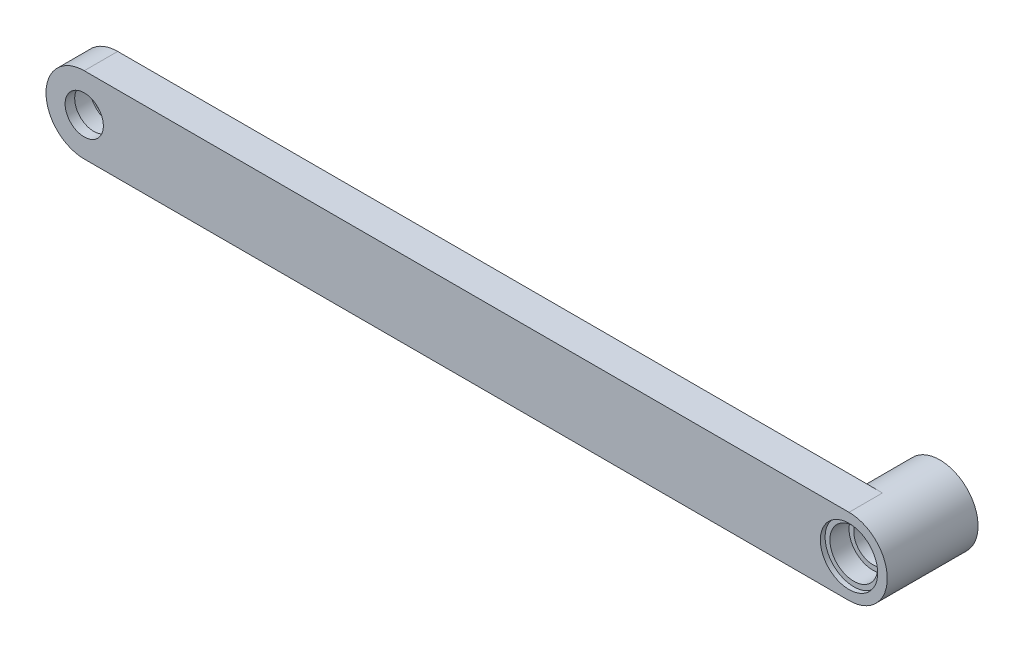
ISO-10303-21;
HEADER;
FILE_DESCRIPTION(('STEP AP214'),'2;1');
FILE_NAME('part.step','',(''),(''),'','','');
FILE_SCHEMA(('AUTOMOTIVE_DESIGN { 1 0 10303 214 1 1 1 1 }'));
ENDSEC;
DATA;
#1=APPLICATION_CONTEXT('core data for automotive mechanical design processes');
#2=APPLICATION_PROTOCOL_DEFINITION('international standard','automotive_design',2000,#1);
#3=PRODUCT_CONTEXT('',#1,'mechanical');
#4=PRODUCT('Part','Part','',(#3));
#5=PRODUCT_RELATED_PRODUCT_CATEGORY('part','',(#4));
#6=PRODUCT_DEFINITION_FORMATION('','',#4);
#7=PRODUCT_DEFINITION_CONTEXT('part definition',#1,'design');
#8=PRODUCT_DEFINITION('design','',#6,#7);
#9=PRODUCT_DEFINITION_SHAPE('','',#8);
#10=(LENGTH_UNIT() NAMED_UNIT(*) SI_UNIT(.MILLI.,.METRE.));
#11=(NAMED_UNIT(*) PLANE_ANGLE_UNIT() SI_UNIT($,.RADIAN.));
#12=(NAMED_UNIT(*) SI_UNIT($,.STERADIAN.) SOLID_ANGLE_UNIT());
#13=UNCERTAINTY_MEASURE_WITH_UNIT(LENGTH_MEASURE(1.E-05),#10,'distance_accuracy_value','');
#14=(GEOMETRIC_REPRESENTATION_CONTEXT(3) GLOBAL_UNCERTAINTY_ASSIGNED_CONTEXT((#13)) GLOBAL_UNIT_ASSIGNED_CONTEXT((#10,
#11,#12)) REPRESENTATION_CONTEXT('',''));
#15=CARTESIAN_POINT('',(0.,0.,0.));
#16=DIRECTION('',(0.,0.,1.));
#17=DIRECTION('',(1.,0.,0.));
#18=AXIS2_PLACEMENT_3D('',#15,#16,#17);
#19=CARTESIAN_POINT('',(80.,0.,1.));
#20=DIRECTION('',(0.,0.,1.));
#21=DIRECTION('',(1.,0.,0.));
#22=AXIS2_PLACEMENT_3D('',#19,#20,#21);
#23=CYLINDRICAL_SURFACE('',#22,2.50000000000001);
#24=CARTESIAN_POINT('',(80.,0.,1.));
#25=DIRECTION('',(0.,0.,1.));
#26=DIRECTION('',(1.,0.,0.));
#27=AXIS2_PLACEMENT_3D('',#24,#25,#26);
#28=CIRCLE('',#27,2.50000000000001);
#29=CARTESIAN_POINT('',(82.5,0.,1.));
#30=VERTEX_POINT('',#29);
#31=EDGE_CURVE('E174',#30,#30,#28,.T.);
#32=ORIENTED_EDGE('',*,*,#31,.F.);
#33=EDGE_LOOP('',(#32));
#34=FACE_BOUND('',#33,.T.);
#35=CARTESIAN_POINT('',(80.,0.,3.));
#36=DIRECTION('',(0.,0.,1.));
#37=DIRECTION('',(1.,0.,0.));
#38=AXIS2_PLACEMENT_3D('',#35,#36,#37);
#39=CIRCLE('',#38,2.50000000000001);
#40=CARTESIAN_POINT('',(82.5,0.,3.));
#41=VERTEX_POINT('',#40);
#42=EDGE_CURVE('E183',#41,#41,#39,.T.);
#43=ORIENTED_EDGE('',*,*,#42,.T.);
#44=EDGE_LOOP('',(#43));
#45=FACE_BOUND('',#44,.T.);
#46=ADVANCED_FACE('F38',(#34,#45),#23,.F.);
#47=CARTESIAN_POINT('',(80.,0.,3.5));
#48=DIRECTION('',(0.,0.,-1.));
#49=DIRECTION('',(-1.,0.,0.));
#50=AXIS2_PLACEMENT_3D('',#47,#48,#49);
#51=CYLINDRICAL_SURFACE('',#50,2.);
#52=CARTESIAN_POINT('',(80.,0.,-3.5));
#53=DIRECTION('',(0.,0.,-1.));
#54=DIRECTION('',(-1.,0.,0.));
#55=AXIS2_PLACEMENT_3D('',#52,#53,#54);
#56=CIRCLE('',#55,2.);
#57=CARTESIAN_POINT('',(78.,0.,-3.5));
#58=VERTEX_POINT('',#57);
#59=EDGE_CURVE('E158',#58,#58,#56,.T.);
#60=ORIENTED_EDGE('',*,*,#59,.T.);
#61=EDGE_LOOP('',(#60));
#62=FACE_BOUND('',#61,.T.);
#63=CARTESIAN_POINT('',(80.,0.,1.));
#64=DIRECTION('',(0.,0.,1.));
#65=DIRECTION('',(1.,0.,0.));
#66=AXIS2_PLACEMENT_3D('',#63,#64,#65);
#67=CIRCLE('',#66,2.);
#68=CARTESIAN_POINT('',(82.,0.,1.));
#69=VERTEX_POINT('',#68);
#70=EDGE_CURVE('E42',#69,#69,#67,.F.);
#71=ORIENTED_EDGE('',*,*,#70,.F.);
#72=EDGE_LOOP('',(#71));
#73=FACE_BOUND('',#72,.T.);
#74=ADVANCED_FACE('F222',(#62,#73),#51,.F.);
#75=CARTESIAN_POINT('',(80.,0.,-3.5));
#76=DIRECTION('',(0.,0.,-1.));
#77=DIRECTION('',(-1.,0.,0.));
#78=AXIS2_PLACEMENT_3D('',#75,#76,#77);
#79=CYLINDRICAL_SURFACE('',#78,2.50000000000001);
#80=CARTESIAN_POINT('',(80.,0.,-3.5));
#81=DIRECTION('',(0.,0.,-1.));
#82=DIRECTION('',(-1.,0.,0.));
#83=AXIS2_PLACEMENT_3D('',#80,#81,#82);
#84=CIRCLE('',#83,2.50000000000001);
#85=CARTESIAN_POINT('',(77.5,0.,-3.5));
#86=VERTEX_POINT('',#85);
#87=EDGE_CURVE('E154',#86,#86,#84,.T.);
#88=ORIENTED_EDGE('',*,*,#87,.F.);
#89=EDGE_LOOP('',(#88));
#90=FACE_BOUND('',#89,.T.);
#91=CARTESIAN_POINT('',(80.,0.,-5.5));
#92=DIRECTION('',(0.,0.,-1.));
#93=DIRECTION('',(-1.,0.,0.));
#94=AXIS2_PLACEMENT_3D('',#91,#92,#93);
#95=CIRCLE('',#94,2.50000000000001);
#96=CARTESIAN_POINT('',(77.5,0.,-5.5));
#97=VERTEX_POINT('',#96);
#98=EDGE_CURVE('E167',#97,#97,#95,.T.);
#99=ORIENTED_EDGE('',*,*,#98,.T.);
#100=EDGE_LOOP('',(#99));
#101=FACE_BOUND('',#100,.T.);
#102=ADVANCED_FACE('F230',(#90,#101),#79,.F.);
#103=CARTESIAN_POINT('',(0.,0.,2.5));
#104=DIRECTION('',(0.,0.,-1.));
#105=DIRECTION('',(-1.,0.,0.));
#106=AXIS2_PLACEMENT_3D('',#103,#104,#105);
#107=CYLINDRICAL_SURFACE('',#106,2.5);
#108=CARTESIAN_POINT('',(0.,0.,2.5));
#109=DIRECTION('',(0.,0.,-1.));
#110=DIRECTION('',(-1.,0.,0.));
#111=AXIS2_PLACEMENT_3D('',#108,#109,#110);
#112=CIRCLE('',#111,2.5);
#113=CARTESIAN_POINT('',(-2.5,0.,2.5));
#114=VERTEX_POINT('',#113);
#115=EDGE_CURVE('E130',#114,#114,#112,.T.);
#116=ORIENTED_EDGE('',*,*,#115,.F.);
#117=EDGE_LOOP('',(#116));
#118=FACE_BOUND('',#117,.T.);
#119=CARTESIAN_POINT('',(0.,0.,0.5));
#120=DIRECTION('',(0.,0.,-1.));
#121=DIRECTION('',(-1.,0.,0.));
#122=AXIS2_PLACEMENT_3D('',#119,#120,#121);
#123=CIRCLE('',#122,2.5);
#124=CARTESIAN_POINT('',(-2.5,0.,0.5));
#125=VERTEX_POINT('',#124);
#126=EDGE_CURVE('E143',#125,#125,#123,.T.);
#127=ORIENTED_EDGE('',*,*,#126,.T.);
#128=EDGE_LOOP('',(#127));
#129=FACE_BOUND('',#128,.T.);
#130=ADVANCED_FACE('F250',(#118,#129),#107,.F.);
#131=CARTESIAN_POINT('',(0.,0.,3.5));
#132=DIRECTION('',(0.,0.,-1.));
#133=DIRECTION('',(-1.,0.,0.));
#134=AXIS2_PLACEMENT_3D('',#131,#132,#133);
#135=CYLINDRICAL_SURFACE('',#134,2.);
#136=CARTESIAN_POINT('',(0.,0.,3.5));
#137=DIRECTION('',(0.,0.,-1.));
#138=DIRECTION('',(-1.,0.,0.));
#139=AXIS2_PLACEMENT_3D('',#136,#137,#138);
#140=CIRCLE('',#139,2.);
#141=CARTESIAN_POINT('',(-2.,0.,3.5));
#142=VERTEX_POINT('',#141);
#143=EDGE_CURVE('E118',#142,#142,#140,.T.);
#144=ORIENTED_EDGE('',*,*,#143,.F.);
#145=EDGE_LOOP('',(#144));
#146=FACE_BOUND('',#145,.T.);
#147=CARTESIAN_POINT('',(0.,0.,2.5));
#148=DIRECTION('',(0.,0.,-1.));
#149=DIRECTION('',(-1.,0.,0.));
#150=AXIS2_PLACEMENT_3D('',#147,#148,#149);
#151=CIRCLE('',#150,2.);
#152=CARTESIAN_POINT('',(-2.,0.,2.5));
#153=VERTEX_POINT('',#152);
#154=EDGE_CURVE('E134',#153,#153,#151,.T.);
#155=ORIENTED_EDGE('',*,*,#154,.T.);
#156=EDGE_LOOP('',(#155));
#157=FACE_BOUND('',#156,.T.);
#158=ADVANCED_FACE('F220',(#146,#157),#135,.F.);
#159=CARTESIAN_POINT('',(0.,0.,3.5));
#160=DIRECTION('',(0.,0.,-1.));
#161=DIRECTION('',(-1.,0.,0.));
#162=AXIS2_PLACEMENT_3D('',#159,#160,#161);
#163=CYLINDRICAL_SURFACE('',#162,4.);
#164=CARTESIAN_POINT('',(0.,0.,0.));
#165=DIRECTION('',(0.,0.,1.));
#166=DIRECTION('',(1.,0.,0.));
#167=AXIS2_PLACEMENT_3D('',#164,#165,#166);
#168=CIRCLE('',#167,4.);
#169=CARTESIAN_POINT('',(0.,4.,0.));
#170=VERTEX_POINT('',#169);
#171=CARTESIAN_POINT('',(0.,-4.,0.));
#172=VERTEX_POINT('',#171);
#173=EDGE_CURVE('E90',#170,#172,#168,.T.);
#174=ORIENTED_EDGE('',*,*,#173,.T.);
#175=DIRECTION('',(0.,0.,-1.));
#176=VECTOR('',#175,1.);
#177=CARTESIAN_POINT('',(0.,-4.,3.5));
#178=LINE('',#177,#176);
#179=CARTESIAN_POINT('',(0.,-4.,3.5));
#180=VERTEX_POINT('',#179);
#181=EDGE_CURVE('E49',#180,#172,#178,.T.);
#182=ORIENTED_EDGE('',*,*,#181,.F.);
#183=CARTESIAN_POINT('',(0.,0.,3.5));
#184=DIRECTION('',(0.,0.,1.));
#185=DIRECTION('',(1.,0.,0.));
#186=AXIS2_PLACEMENT_3D('',#183,#184,#185);
#187=CIRCLE('',#186,4.);
#188=CARTESIAN_POINT('',(0.,4.,3.5));
#189=VERTEX_POINT('',#188);
#190=EDGE_CURVE('E92',#189,#180,#187,.T.);
#191=ORIENTED_EDGE('',*,*,#190,.F.);
#192=DIRECTION('',(0.,0.,-1.));
#193=VECTOR('',#192,1.);
#194=CARTESIAN_POINT('',(0.,4.,3.5));
#195=LINE('',#194,#193);
#196=EDGE_CURVE('E102',#189,#170,#195,.T.);
#197=ORIENTED_EDGE('',*,*,#196,.T.);
#198=EDGE_LOOP('',(#174,#182,#191,#197));
#199=FACE_BOUND('',#198,.T.);
#200=ADVANCED_FACE('F40',(#199),#163,.T.);
#201=CARTESIAN_POINT('',(0.,-4.,3.5));
#202=DIRECTION('',(0.,1.,0.));
#203=DIRECTION('',(-1.,0.,0.));
#204=AXIS2_PLACEMENT_3D('',#201,#202,#203);
#205=PLANE('',#204);
#206=DIRECTION('',(1.,0.,0.));
#207=VECTOR('',#206,1.);
#208=CARTESIAN_POINT('',(0.,-4.,0.));
#209=LINE('',#208,#207);
#210=CARTESIAN_POINT('',(80.,-4.00000000000001,0.));
#211=VERTEX_POINT('',#210);
#212=EDGE_CURVE('E93',#172,#211,#209,.T.);
#213=ORIENTED_EDGE('',*,*,#212,.T.);
#214=DIRECTION('',(0.,0.,-1.));
#215=VECTOR('',#214,1.);
#216=CARTESIAN_POINT('',(80.,-4.00000000000001,3.5));
#217=LINE('',#216,#215);
#218=CARTESIAN_POINT('',(80.,-4.00000000000001,3.5));
#219=VERTEX_POINT('',#218);
#220=EDGE_CURVE('E101',#219,#211,#217,.T.);
#221=ORIENTED_EDGE('',*,*,#220,.F.);
#222=DIRECTION('',(1.,0.,0.));
#223=VECTOR('',#222,1.);
#224=CARTESIAN_POINT('',(0.,-4.,3.5));
#225=LINE('',#224,#223);
#226=EDGE_CURVE('E84',#180,#219,#225,.T.);
#227=ORIENTED_EDGE('',*,*,#226,.F.);
#228=ORIENTED_EDGE('',*,*,#181,.T.);
#229=EDGE_LOOP('',(#213,#221,#227,#228));
#230=FACE_BOUND('',#229,.T.);
#231=ADVANCED_FACE('F213',(#230),#205,.F.);
#232=CARTESIAN_POINT('',(80.,0.,3.5));
#233=DIRECTION('',(0.,0.,-1.));
#234=DIRECTION('',(-1.,0.,0.));
#235=AXIS2_PLACEMENT_3D('',#232,#233,#234);
#236=CYLINDRICAL_SURFACE('',#235,4.00000000000001);
#237=ORIENTED_EDGE('',*,*,#220,.T.);
#238=CARTESIAN_POINT('',(80.,0.,0.));
#239=DIRECTION('',(0.,0.,-1.));
#240=DIRECTION('',(-1.,0.,0.));
#241=AXIS2_PLACEMENT_3D('',#238,#239,#240);
#242=CIRCLE('',#241,4.00000000000001);
#243=CARTESIAN_POINT('',(80.,4.00000000000001,0.));
#244=VERTEX_POINT('',#243);
#245=EDGE_CURVE('E11',#211,#244,#242,.T.);
#246=ORIENTED_EDGE('',*,*,#245,.T.);
#247=DIRECTION('',(0.,0.,-1.));
#248=VECTOR('',#247,1.);
#249=CARTESIAN_POINT('',(80.,4.00000000000001,3.5));
#250=LINE('',#249,#248);
#251=CARTESIAN_POINT('',(80.,4.00000000000001,3.5));
#252=VERTEX_POINT('',#251);
#253=EDGE_CURVE('E96',#252,#244,#250,.T.);
#254=ORIENTED_EDGE('',*,*,#253,.F.);
#255=CARTESIAN_POINT('',(80.,0.,3.5));
#256=DIRECTION('',(0.,0.,1.));
#257=DIRECTION('',(1.,0.,0.));
#258=AXIS2_PLACEMENT_3D('',#255,#256,#257);
#259=CIRCLE('',#258,4.00000000000001);
#260=EDGE_CURVE('E107',#219,#252,#259,.T.);
#261=ORIENTED_EDGE('',*,*,#260,.F.);
#262=EDGE_LOOP('',(#237,#246,#254,#261));
#263=FACE_BOUND('',#262,.T.);
#264=CARTESIAN_POINT('',(80.,0.,-6.));
#265=DIRECTION('',(0.,0.,-1.));
#266=DIRECTION('',(-1.,0.,0.));
#267=AXIS2_PLACEMENT_3D('',#264,#265,#266);
#268=CIRCLE('',#267,4.00000000000001);
#269=CARTESIAN_POINT('',(76.,0.,-6.));
#270=VERTEX_POINT('',#269);
#271=EDGE_CURVE('E144',#270,#270,#268,.T.);
#272=ORIENTED_EDGE('',*,*,#271,.F.);
#273=EDGE_LOOP('',(#272));
#274=FACE_BOUND('',#273,.T.);
#275=ADVANCED_FACE('F105',(#263,#274),#236,.T.);
#276=CARTESIAN_POINT('',(0.,4.,3.5));
#277=DIRECTION('',(0.,-1.,0.));
#278=DIRECTION('',(1.,0.,0.));
#279=AXIS2_PLACEMENT_3D('',#276,#277,#278);
#280=PLANE('',#279);
#281=DIRECTION('',(-1.,0.,0.));
#282=VECTOR('',#281,1.);
#283=CARTESIAN_POINT('',(0.,4.,0.));
#284=LINE('',#283,#282);
#285=EDGE_CURVE('E76',#244,#170,#284,.T.);
#286=ORIENTED_EDGE('',*,*,#285,.T.);
#287=ORIENTED_EDGE('',*,*,#196,.F.);
#288=DIRECTION('',(-1.,0.,0.));
#289=VECTOR('',#288,1.);
#290=CARTESIAN_POINT('',(0.,4.,3.5));
#291=LINE('',#290,#289);
#292=EDGE_CURVE('E58',#252,#189,#291,.T.);
#293=ORIENTED_EDGE('',*,*,#292,.F.);
#294=ORIENTED_EDGE('',*,*,#253,.T.);
#295=EDGE_LOOP('',(#286,#287,#293,#294));
#296=FACE_BOUND('',#295,.T.);
#297=ADVANCED_FACE('F97',(#296),#280,.F.);
#298=CARTESIAN_POINT('',(0.,0.,3.5));
#299=DIRECTION('',(0.,0.,1.));
#300=DIRECTION('',(1.,0.,0.));
#301=AXIS2_PLACEMENT_3D('',#298,#299,#300);
#302=PLANE('',#301);
#303=CARTESIAN_POINT('',(80.,0.,3.5));
#304=DIRECTION('',(0.,0.,1.));
#305=DIRECTION('',(1.,0.,0.));
#306=AXIS2_PLACEMENT_3D('',#303,#304,#305);
#307=CIRCLE('',#306,3.00000000000001);
#308=CARTESIAN_POINT('',(83.,0.,3.5));
#309=VERTEX_POINT('',#308);
#310=EDGE_CURVE('E179',#309,#309,#307,.T.);
#311=ORIENTED_EDGE('',*,*,#310,.F.);
#312=EDGE_LOOP('',(#311));
#313=FACE_BOUND('',#312,.T.);
#314=ORIENTED_EDGE('',*,*,#143,.T.);
#315=EDGE_LOOP('',(#314));
#316=FACE_BOUND('',#315,.T.);
#317=ORIENTED_EDGE('',*,*,#190,.T.);
#318=ORIENTED_EDGE('',*,*,#226,.T.);
#319=ORIENTED_EDGE('',*,*,#260,.T.);
#320=ORIENTED_EDGE('',*,*,#292,.T.);
#321=EDGE_LOOP('',(#317,#318,#319,#320));
#322=FACE_BOUND('',#321,.T.);
#323=ADVANCED_FACE('F205',(#313,#316,#322),#302,.T.);
#324=CARTESIAN_POINT('',(0.,0.,0.));
#325=DIRECTION('',(0.,0.,1.));
#326=DIRECTION('',(1.,0.,0.));
#327=AXIS2_PLACEMENT_3D('',#324,#325,#326);
#328=PLANE('',#327);
#329=ORIENTED_EDGE('',*,*,#245,.F.);
#330=ORIENTED_EDGE('',*,*,#212,.F.);
#331=ORIENTED_EDGE('',*,*,#173,.F.);
#332=ORIENTED_EDGE('',*,*,#285,.F.);
#333=EDGE_LOOP('',(#329,#330,#331,#332));
#334=FACE_BOUND('',#333,.T.);
#335=CARTESIAN_POINT('',(0.,0.,0.));
#336=DIRECTION('',(0.,0.,-1.));
#337=DIRECTION('',(-1.,0.,0.));
#338=AXIS2_PLACEMENT_3D('',#335,#336,#337);
#339=CIRCLE('',#338,3.);
#340=CARTESIAN_POINT('',(-3.,0.,0.));
#341=VERTEX_POINT('',#340);
#342=EDGE_CURVE('E139',#341,#341,#339,.T.);
#343=ORIENTED_EDGE('',*,*,#342,.F.);
#344=EDGE_LOOP('',(#343));
#345=FACE_BOUND('',#344,.T.);
#346=ADVANCED_FACE('F87',(#334,#345),#328,.F.);
#347=CARTESIAN_POINT('',(0.,0.,2.5));
#348=DIRECTION('',(0.,0.,-1.));
#349=DIRECTION('',(-1.,0.,0.));
#350=AXIS2_PLACEMENT_3D('',#347,#348,#349);
#351=PLANE('',#350);
#352=ORIENTED_EDGE('',*,*,#154,.F.);
#353=EDGE_LOOP('',(#352));
#354=FACE_BOUND('',#353,.T.);
#355=ORIENTED_EDGE('',*,*,#115,.T.);
#356=EDGE_LOOP('',(#355));
#357=FACE_BOUND('',#356,.T.);
#358=ADVANCED_FACE('F263',(#354,#357),#351,.T.);
#359=CARTESIAN_POINT('',(0.,0.,0.5));
#360=DIRECTION('',(0.,0.,-1.));
#361=DIRECTION('',(-1.,0.,0.));
#362=AXIS2_PLACEMENT_3D('',#359,#360,#361);
#363=CYLINDRICAL_SURFACE('',#362,3.);
#364=CARTESIAN_POINT('',(0.,0.,0.5));
#365=DIRECTION('',(0.,0.,-1.));
#366=DIRECTION('',(-1.,0.,0.));
#367=AXIS2_PLACEMENT_3D('',#364,#365,#366);
#368=CIRCLE('',#367,3.);
#369=CARTESIAN_POINT('',(-3.,0.,0.5));
#370=VERTEX_POINT('',#369);
#371=EDGE_CURVE('E138',#370,#370,#368,.T.);
#372=ORIENTED_EDGE('',*,*,#371,.F.);
#373=EDGE_LOOP('',(#372));
#374=FACE_BOUND('',#373,.T.);
#375=ORIENTED_EDGE('',*,*,#342,.T.);
#376=EDGE_LOOP('',(#375));
#377=FACE_BOUND('',#376,.T.);
#378=ADVANCED_FACE('F259',(#374,#377),#363,.F.);
#379=CARTESIAN_POINT('',(0.,0.,0.5));
#380=DIRECTION('',(0.,0.,-1.));
#381=DIRECTION('',(-1.,0.,0.));
#382=AXIS2_PLACEMENT_3D('',#379,#380,#381);
#383=PLANE('',#382);
#384=ORIENTED_EDGE('',*,*,#126,.F.);
#385=EDGE_LOOP('',(#384));
#386=FACE_BOUND('',#385,.T.);
#387=ORIENTED_EDGE('',*,*,#371,.T.);
#388=EDGE_LOOP('',(#387));
#389=FACE_BOUND('',#388,.T.);
#390=ADVANCED_FACE('F255',(#386,#389),#383,.T.);
#391=CARTESIAN_POINT('',(80.,0.,-6.));
#392=DIRECTION('',(0.,0.,-1.));
#393=DIRECTION('',(-1.,0.,0.));
#394=AXIS2_PLACEMENT_3D('',#391,#392,#393);
#395=PLANE('',#394);
#396=CARTESIAN_POINT('',(80.,0.,-6.));
#397=DIRECTION('',(0.,0.,-1.));
#398=DIRECTION('',(-1.,0.,0.));
#399=AXIS2_PLACEMENT_3D('',#396,#397,#398);
#400=CIRCLE('',#399,3.00000000000001);
#401=CARTESIAN_POINT('',(77.,0.,-6.));
#402=VERTEX_POINT('',#401);
#403=EDGE_CURVE('E163',#402,#402,#400,.T.);
#404=ORIENTED_EDGE('',*,*,#403,.F.);
#405=EDGE_LOOP('',(#404));
#406=FACE_BOUND('',#405,.T.);
#407=ORIENTED_EDGE('',*,*,#271,.T.);
#408=EDGE_LOOP('',(#407));
#409=FACE_BOUND('',#408,.T.);
#410=ADVANCED_FACE('F247',(#406,#409),#395,.T.);
#411=CARTESIAN_POINT('',(0.,0.,-3.5));
#412=DIRECTION('',(0.,0.,-1.));
#413=DIRECTION('',(-1.,0.,0.));
#414=AXIS2_PLACEMENT_3D('',#411,#412,#413);
#415=PLANE('',#414);
#416=ORIENTED_EDGE('',*,*,#59,.F.);
#417=EDGE_LOOP('',(#416));
#418=FACE_BOUND('',#417,.T.);
#419=ORIENTED_EDGE('',*,*,#87,.T.);
#420=EDGE_LOOP('',(#419));
#421=FACE_BOUND('',#420,.T.);
#422=ADVANCED_FACE('F243',(#418,#421),#415,.T.);
#423=CARTESIAN_POINT('',(80.,0.,-5.5));
#424=DIRECTION('',(0.,0.,-1.));
#425=DIRECTION('',(-1.,0.,0.));
#426=AXIS2_PLACEMENT_3D('',#423,#424,#425);
#427=CYLINDRICAL_SURFACE('',#426,3.00000000000001);
#428=CARTESIAN_POINT('',(80.,0.,-5.5));
#429=DIRECTION('',(0.,0.,-1.));
#430=DIRECTION('',(-1.,0.,0.));
#431=AXIS2_PLACEMENT_3D('',#428,#429,#430);
#432=CIRCLE('',#431,3.00000000000001);
#433=CARTESIAN_POINT('',(77.,0.,-5.5));
#434=VERTEX_POINT('',#433);
#435=EDGE_CURVE('E162',#434,#434,#432,.T.);
#436=ORIENTED_EDGE('',*,*,#435,.F.);
#437=EDGE_LOOP('',(#436));
#438=FACE_BOUND('',#437,.T.);
#439=ORIENTED_EDGE('',*,*,#403,.T.);
#440=EDGE_LOOP('',(#439));
#441=FACE_BOUND('',#440,.T.);
#442=ADVANCED_FACE('F239',(#438,#441),#427,.F.);
#443=CARTESIAN_POINT('',(0.,0.,-5.5));
#444=DIRECTION('',(0.,0.,-1.));
#445=DIRECTION('',(-1.,0.,0.));
#446=AXIS2_PLACEMENT_3D('',#443,#444,#445);
#447=PLANE('',#446);
#448=ORIENTED_EDGE('',*,*,#98,.F.);
#449=EDGE_LOOP('',(#448));
#450=FACE_BOUND('',#449,.T.);
#451=ORIENTED_EDGE('',*,*,#435,.T.);
#452=EDGE_LOOP('',(#451));
#453=FACE_BOUND('',#452,.T.);
#454=ADVANCED_FACE('F236',(#450,#453),#447,.T.);
#455=CARTESIAN_POINT('',(80.,0.,1.));
#456=DIRECTION('',(0.,0.,1.));
#457=DIRECTION('',(1.,0.,0.));
#458=AXIS2_PLACEMENT_3D('',#455,#456,#457);
#459=PLANE('',#458);
#460=ORIENTED_EDGE('',*,*,#31,.T.);
#461=EDGE_LOOP('',(#460));
#462=FACE_BOUND('',#461,.T.);
#463=ORIENTED_EDGE('',*,*,#70,.T.);
#464=EDGE_LOOP('',(#463));
#465=FACE_BOUND('',#464,.T.);
#466=ADVANCED_FACE('F201',(#462,#465),#459,.T.);
#467=CARTESIAN_POINT('',(80.,0.,3.));
#468=DIRECTION('',(0.,0.,1.));
#469=DIRECTION('',(1.,0.,0.));
#470=AXIS2_PLACEMENT_3D('',#467,#468,#469);
#471=CYLINDRICAL_SURFACE('',#470,3.00000000000001);
#472=CARTESIAN_POINT('',(80.,0.,3.));
#473=DIRECTION('',(0.,0.,1.));
#474=DIRECTION('',(1.,0.,0.));
#475=AXIS2_PLACEMENT_3D('',#472,#473,#474);
#476=CIRCLE('',#475,3.00000000000001);
#477=CARTESIAN_POINT('',(83.,0.,3.));
#478=VERTEX_POINT('',#477);
#479=EDGE_CURVE('E178',#478,#478,#476,.T.);
#480=ORIENTED_EDGE('',*,*,#479,.F.);
#481=EDGE_LOOP('',(#480));
#482=FACE_BOUND('',#481,.T.);
#483=ORIENTED_EDGE('',*,*,#310,.T.);
#484=EDGE_LOOP('',(#483));
#485=FACE_BOUND('',#484,.T.);
#486=ADVANCED_FACE('F195',(#482,#485),#471,.F.);
#487=CARTESIAN_POINT('',(80.,0.,3.));
#488=DIRECTION('',(0.,0.,1.));
#489=DIRECTION('',(1.,0.,0.));
#490=AXIS2_PLACEMENT_3D('',#487,#488,#489);
#491=PLANE('',#490);
#492=ORIENTED_EDGE('',*,*,#42,.F.);
#493=EDGE_LOOP('',(#492));
#494=FACE_BOUND('',#493,.T.);
#495=ORIENTED_EDGE('',*,*,#479,.T.);
#496=EDGE_LOOP('',(#495));
#497=FACE_BOUND('',#496,.T.);
#498=ADVANCED_FACE('F192',(#494,#497),#491,.T.);
#499=CLOSED_SHELL('',(#46,#74,#102,#130,#158,#200,#231,#275,#297,#323,#346,#358,#378,#390,#410,
#422,#442,#454,#466,#486,#498));
#500=MANIFOLD_SOLID_BREP('B2',#499);
#501=ADVANCED_BREP_SHAPE_REPRESENTATION('',(#18,#500),#14);
#502=SHAPE_DEFINITION_REPRESENTATION(#9,#501);
ENDSEC;
END-ISO-10303-21;
